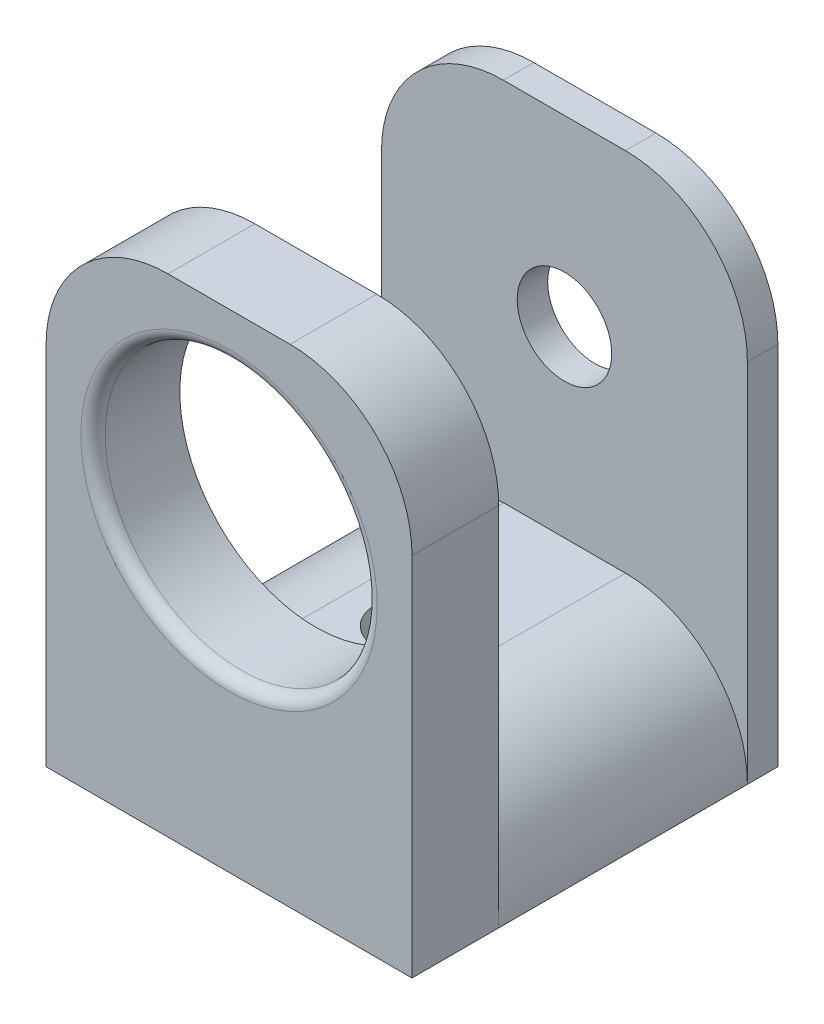
ISO-10303-21;
HEADER;
FILE_DESCRIPTION(('STEP AP214'),'2;1');
FILE_NAME('part.step','',(''),(''),'','','');
FILE_SCHEMA(('AUTOMOTIVE_DESIGN { 1 0 10303 214 1 1 1 1 }'));
ENDSEC;
DATA;
#1=APPLICATION_CONTEXT('core data for automotive mechanical design processes');
#2=APPLICATION_PROTOCOL_DEFINITION('international standard','automotive_design',2000,#1);
#3=PRODUCT_CONTEXT('',#1,'mechanical');
#4=PRODUCT('Part','Part','',(#3));
#5=PRODUCT_RELATED_PRODUCT_CATEGORY('part','',(#4));
#6=PRODUCT_DEFINITION_FORMATION('','',#4);
#7=PRODUCT_DEFINITION_CONTEXT('part definition',#1,'design');
#8=PRODUCT_DEFINITION('design','',#6,#7);
#9=PRODUCT_DEFINITION_SHAPE('','',#8);
#10=(LENGTH_UNIT() NAMED_UNIT(*) SI_UNIT(.MILLI.,.METRE.));
#11=(NAMED_UNIT(*) PLANE_ANGLE_UNIT() SI_UNIT($,.RADIAN.));
#12=(NAMED_UNIT(*) SI_UNIT($,.STERADIAN.) SOLID_ANGLE_UNIT());
#13=UNCERTAINTY_MEASURE_WITH_UNIT(LENGTH_MEASURE(1.E-05),#10,'distance_accuracy_value','');
#14=(GEOMETRIC_REPRESENTATION_CONTEXT(3) GLOBAL_UNCERTAINTY_ASSIGNED_CONTEXT((#13)) GLOBAL_UNIT_ASSIGNED_CONTEXT((#10,
#11,#12)) REPRESENTATION_CONTEXT('',''));
#15=CARTESIAN_POINT('',(0.,0.,0.));
#16=DIRECTION('',(0.,0.,1.));
#17=DIRECTION('',(1.,0.,0.));
#18=AXIS2_PLACEMENT_3D('',#15,#16,#17);
#19=CARTESIAN_POINT('',(-11.8122713901151,10.,-2.11650692687219));
#20=DIRECTION('',(1.,0.,0.));
#21=DIRECTION('',(0.,0.,-1.));
#22=AXIS2_PLACEMENT_3D('',#19,#20,#21);
#23=PLANE('',#22);
#24=DIRECTION('',(0.,-1.,0.));
#25=VECTOR('',#24,1.);
#26=CARTESIAN_POINT('',(-11.8122713901151,10.,-2.11650692687219));
#27=LINE('',#26,#25);
#28=CARTESIAN_POINT('',(-11.8122713901151,30.,-2.11650692687219));
#29=VERTEX_POINT('',#28);
#30=CARTESIAN_POINT('',(-11.8122713901151,0.,-2.11650692687219));
#31=VERTEX_POINT('',#30);
#32=EDGE_CURVE('E178',#29,#31,#27,.T.);
#33=ORIENTED_EDGE('',*,*,#32,.F.);
#34=DIRECTION('',(0.,0.,1.));
#35=VECTOR('',#34,1.);
#36=CARTESIAN_POINT('',(-11.8122713901151,30.,-2.11650692687219));
#37=LINE('',#36,#35);
#38=CARTESIAN_POINT('',(-11.8122713901151,30.,-9.22850692687219));
#39=VERTEX_POINT('',#38);
#40=EDGE_CURVE('E11',#29,#39,#37,.F.);
#41=ORIENTED_EDGE('',*,*,#40,.T.);
#42=DIRECTION('',(0.,-1.,0.));
#43=VECTOR('',#42,1.);
#44=CARTESIAN_POINT('',(-11.8122713901151,40.,-9.22850692687219));
#45=LINE('',#44,#43);
#46=CARTESIAN_POINT('',(-11.8122713901151,0.,-9.22850692687219));
#47=VERTEX_POINT('',#46);
#48=EDGE_CURVE('E223',#39,#47,#45,.T.);
#49=ORIENTED_EDGE('',*,*,#48,.T.);
#50=DIRECTION('',(0.,0.,1.));
#51=VECTOR('',#50,1.);
#52=CARTESIAN_POINT('',(-11.8122713901151,0.,-2.11650692687219));
#53=LINE('',#52,#51);
#54=EDGE_CURVE('E165',#47,#31,#53,.T.);
#55=ORIENTED_EDGE('',*,*,#54,.T.);
#56=EDGE_LOOP('',(#33,#41,#49,#55));
#57=FACE_BOUND('',#56,.T.);
#58=ADVANCED_FACE('F32',(#57),#23,.F.);
#59=CARTESIAN_POINT('',(18.1877286098849,10.,-2.1165069268722));
#60=DIRECTION('',(-1.,0.,0.));
#61=DIRECTION('',(0.,0.,1.));
#62=AXIS2_PLACEMENT_3D('',#59,#60,#61);
#63=PLANE('',#62);
#64=DIRECTION('',(0.,-1.,0.));
#65=VECTOR('',#64,1.);
#66=CARTESIAN_POINT('',(18.1877286098849,40.,-29.6165069268722));
#67=LINE('',#66,#65);
#68=CARTESIAN_POINT('',(18.1877286098849,30.,-29.6165069268722));
#69=VERTEX_POINT('',#68);
#70=CARTESIAN_POINT('',(18.1877286098849,0.,-29.6165069268722));
#71=VERTEX_POINT('',#70);
#72=EDGE_CURVE('E139',#69,#71,#67,.T.);
#73=ORIENTED_EDGE('',*,*,#72,.T.);
#74=DIRECTION('',(0.,0.,-1.));
#75=VECTOR('',#74,1.);
#76=CARTESIAN_POINT('',(18.1877286098849,0.,-2.1165069268722));
#77=LINE('',#76,#75);
#78=CARTESIAN_POINT('',(18.1877286098849,0.,-32.1165069268722));
#79=VERTEX_POINT('',#78);
#80=EDGE_CURVE('E133',#71,#79,#77,.T.);
#81=ORIENTED_EDGE('',*,*,#80,.T.);
#82=DIRECTION('',(0.,-1.,0.));
#83=VECTOR('',#82,1.);
#84=CARTESIAN_POINT('',(18.1877286098849,10.,-32.1165069268722));
#85=LINE('',#84,#83);
#86=CARTESIAN_POINT('',(18.1877286098849,30.,-32.1165069268722));
#87=VERTEX_POINT('',#86);
#88=EDGE_CURVE('E136',#87,#79,#85,.T.);
#89=ORIENTED_EDGE('',*,*,#88,.F.);
#90=DIRECTION('',(0.,0.,-1.));
#91=VECTOR('',#90,1.);
#92=CARTESIAN_POINT('',(18.1877286098849,30.,-29.6165069268722));
#93=LINE('',#92,#91);
#94=EDGE_CURVE('E201',#87,#69,#93,.F.);
#95=ORIENTED_EDGE('',*,*,#94,.T.);
#96=EDGE_LOOP('',(#73,#81,#89,#95));
#97=FACE_BOUND('',#96,.T.);
#98=ADVANCED_FACE('F135',(#97),#63,.F.);
#99=CARTESIAN_POINT('',(0.,10.,0.));
#100=DIRECTION('',(0.,1.,0.));
#101=DIRECTION('',(0.,0.,1.));
#102=AXIS2_PLACEMENT_3D('',#99,#100,#101);
#103=PLANE('',#102);
#104=CARTESIAN_POINT('',(3.18772860988485,10.,-17.1165069268722));
#105=DIRECTION('',(0.,1.,0.));
#106=DIRECTION('',(0.,0.,1.));
#107=AXIS2_PLACEMENT_3D('',#104,#105,#106);
#108=CIRCLE('',#107,3.);
#109=CARTESIAN_POINT('',(3.18772860988485,10.,-14.1165069268722));
#110=VERTEX_POINT('',#109);
#111=EDGE_CURVE('E241',#110,#110,#108,.T.);
#112=ORIENTED_EDGE('',*,*,#111,.F.);
#113=EDGE_LOOP('',(#112));
#114=FACE_BOUND('',#113,.T.);
#115=DIRECTION('',(1.,0.,0.));
#116=VECTOR('',#115,1.);
#117=CARTESIAN_POINT('',(-11.8122713901151,10.,-29.6165069268722));
#118=LINE('',#117,#116);
#119=CARTESIAN_POINT('',(-1.81227139011515,10.,-29.6165069268722));
#120=VERTEX_POINT('',#119);
#121=CARTESIAN_POINT('',(8.18772860988485,10.,-29.6165069268722));
#122=VERTEX_POINT('',#121);
#123=EDGE_CURVE('E211',#120,#122,#118,.T.);
#124=ORIENTED_EDGE('',*,*,#123,.F.);
#125=DIRECTION('',(0.,0.,1.));
#126=VECTOR('',#125,1.);
#127=CARTESIAN_POINT('',(-1.81227139011515,10.,-9.22850692687219));
#128=LINE('',#127,#126);
#129=CARTESIAN_POINT('',(-1.81227139011515,10.,-9.22850692687219));
#130=VERTEX_POINT('',#129);
#131=EDGE_CURVE('E210',#120,#130,#128,.T.);
#132=ORIENTED_EDGE('',*,*,#131,.T.);
#133=DIRECTION('',(-1.,0.,0.));
#134=VECTOR('',#133,1.);
#135=CARTESIAN_POINT('',(-11.8122713901151,10.,-9.22850692687219));
#136=LINE('',#135,#134);
#137=CARTESIAN_POINT('',(8.18772860988485,10.,-9.22850692687219));
#138=VERTEX_POINT('',#137);
#139=EDGE_CURVE('E226',#138,#130,#136,.T.);
#140=ORIENTED_EDGE('',*,*,#139,.F.);
#141=DIRECTION('',(0.,0.,-1.));
#142=VECTOR('',#141,1.);
#143=CARTESIAN_POINT('',(8.18772860988485,10.,-29.6165069268722));
#144=LINE('',#143,#142);
#145=EDGE_CURVE('E203',#138,#122,#144,.T.);
#146=ORIENTED_EDGE('',*,*,#145,.T.);
#147=EDGE_LOOP('',(#124,#132,#140,#146));
#148=FACE_BOUND('',#147,.T.);
#149=ADVANCED_FACE('F247',(#114,#148),#103,.T.);
#150=DIRECTION('',(0.,-1.,0.));
#151=VECTOR('',#150,1.);
#152=CARTESIAN_POINT('',(18.1877286098849,40.,-9.22850692687219));
#153=LINE('',#152,#151);
#154=CARTESIAN_POINT('',(18.1877286098849,30.,-9.22850692687219));
#155=VERTEX_POINT('',#154);
#156=CARTESIAN_POINT('',(18.1877286098849,0.,-9.22850692687219));
#157=VERTEX_POINT('',#156);
#158=EDGE_CURVE('E214',#155,#157,#153,.T.);
#159=ORIENTED_EDGE('',*,*,#158,.F.);
#160=DIRECTION('',(0.,0.,-1.));
#161=VECTOR('',#160,1.);
#162=CARTESIAN_POINT('',(18.1877286098849,30.,-2.1165069268722));
#163=LINE('',#162,#161);
#164=CARTESIAN_POINT('',(18.1877286098849,30.,-2.1165069268722));
#165=VERTEX_POINT('',#164);
#166=EDGE_CURVE('E55',#155,#165,#163,.F.);
#167=ORIENTED_EDGE('',*,*,#166,.T.);
#168=DIRECTION('',(0.,-1.,0.));
#169=VECTOR('',#168,1.);
#170=CARTESIAN_POINT('',(18.1877286098849,10.,-2.1165069268722));
#171=LINE('',#170,#169);
#172=CARTESIAN_POINT('',(18.1877286098849,0.,-2.1165069268722));
#173=VERTEX_POINT('',#172);
#174=EDGE_CURVE('E176',#165,#173,#171,.T.);
#175=ORIENTED_EDGE('',*,*,#174,.T.);
#176=EDGE_CURVE('E148',#173,#157,#77,.T.);
#177=ORIENTED_EDGE('',*,*,#176,.T.);
#178=EDGE_LOOP('',(#159,#167,#175,#177));
#179=FACE_BOUND('',#178,.T.);
#180=ADVANCED_FACE('F250',(#179),#63,.F.);
#181=CARTESIAN_POINT('',(18.1877286098849,10.,-32.1165069268722));
#182=DIRECTION('',(0.,0.,1.));
#183=DIRECTION('',(1.,0.,0.));
#184=AXIS2_PLACEMENT_3D('',#181,#182,#183);
#185=PLANE('',#184);
#186=CARTESIAN_POINT('',(3.18772860988485,25.,-32.1165069268722));
#187=DIRECTION('',(0.,0.,-1.));
#188=DIRECTION('',(-1.,0.,0.));
#189=AXIS2_PLACEMENT_3D('',#186,#187,#188);
#190=CIRCLE('',#189,3.875);
#191=CARTESIAN_POINT('',(-0.687271390115151,25.,-32.1165069268722));
#192=VERTEX_POINT('',#191);
#193=EDGE_CURVE('E238',#192,#192,#190,.T.);
#194=ORIENTED_EDGE('',*,*,#193,.F.);
#195=EDGE_LOOP('',(#194));
#196=FACE_BOUND('',#195,.T.);
#197=DIRECTION('',(0.,-1.,0.));
#198=VECTOR('',#197,1.);
#199=CARTESIAN_POINT('',(-11.8122713901151,10.,-32.1165069268722));
#200=LINE('',#199,#198);
#201=CARTESIAN_POINT('',(-11.8122713901151,30.,-32.1165069268722));
#202=VERTEX_POINT('',#201);
#203=CARTESIAN_POINT('',(-11.8122713901151,0.,-32.1165069268722));
#204=VERTEX_POINT('',#203);
#205=EDGE_CURVE('E158',#202,#204,#200,.T.);
#206=ORIENTED_EDGE('',*,*,#205,.F.);
#207=CARTESIAN_POINT('',(-1.81227139011515,30.,-32.1165069268722));
#208=DIRECTION('',(0.,0.,1.));
#209=DIRECTION('',(1.,0.,0.));
#210=AXIS2_PLACEMENT_3D('',#207,#208,#209);
#211=CIRCLE('',#210,10.);
#212=CARTESIAN_POINT('',(-1.81227139011515,40.,-32.1165069268722));
#213=VERTEX_POINT('',#212);
#214=EDGE_CURVE('E199',#202,#213,#211,.F.);
#215=ORIENTED_EDGE('',*,*,#214,.T.);
#216=DIRECTION('',(-1.,0.,0.));
#217=VECTOR('',#216,1.);
#218=CARTESIAN_POINT('',(-11.8122713901151,40.,-32.1165069268722));
#219=LINE('',#218,#217);
#220=CARTESIAN_POINT('',(8.18772860988485,40.,-32.1165069268722));
#221=VERTEX_POINT('',#220);
#222=EDGE_CURVE('E188',#221,#213,#219,.T.);
#223=ORIENTED_EDGE('',*,*,#222,.F.);
#224=CARTESIAN_POINT('',(8.18772860988485,30.,-32.1165069268722));
#225=DIRECTION('',(0.,0.,1.));
#226=DIRECTION('',(1.,0.,0.));
#227=AXIS2_PLACEMENT_3D('',#224,#225,#226);
#228=CIRCLE('',#227,10.);
#229=EDGE_CURVE('E156',#221,#87,#228,.F.);
#230=ORIENTED_EDGE('',*,*,#229,.T.);
#231=ORIENTED_EDGE('',*,*,#88,.T.);
#232=DIRECTION('',(-1.,0.,0.));
#233=VECTOR('',#232,1.);
#234=CARTESIAN_POINT('',(18.1877286098849,0.,-32.1165069268722));
#235=LINE('',#234,#233);
#236=EDGE_CURVE('E153',#79,#204,#235,.T.);
#237=ORIENTED_EDGE('',*,*,#236,.T.);
#238=EDGE_LOOP('',(#206,#215,#223,#230,#231,#237));
#239=FACE_BOUND('',#238,.T.);
#240=ADVANCED_FACE('F152',(#196,#239),#185,.F.);
#241=CARTESIAN_POINT('',(-11.8122713901151,0.,-29.6165069268722));
#242=VERTEX_POINT('',#241);
#243=EDGE_CURVE('E164',#204,#242,#53,.T.);
#244=ORIENTED_EDGE('',*,*,#243,.T.);
#245=DIRECTION('',(0.,-1.,0.));
#246=VECTOR('',#245,1.);
#247=CARTESIAN_POINT('',(-11.8122713901151,40.,-29.6165069268722));
#248=LINE('',#247,#246);
#249=CARTESIAN_POINT('',(-11.8122713901151,30.,-29.6165069268722));
#250=VERTEX_POINT('',#249);
#251=EDGE_CURVE('E146',#250,#242,#248,.T.);
#252=ORIENTED_EDGE('',*,*,#251,.F.);
#253=DIRECTION('',(0.,0.,1.));
#254=VECTOR('',#253,1.);
#255=CARTESIAN_POINT('',(-11.8122713901151,30.,-32.1165069268722));
#256=LINE('',#255,#254);
#257=EDGE_CURVE('E196',#250,#202,#256,.F.);
#258=ORIENTED_EDGE('',*,*,#257,.T.);
#259=ORIENTED_EDGE('',*,*,#205,.T.);
#260=EDGE_LOOP('',(#244,#252,#258,#259));
#261=FACE_BOUND('',#260,.T.);
#262=ADVANCED_FACE('F341',(#261),#23,.F.);
#263=CARTESIAN_POINT('',(18.1877286098849,10.,-2.1165069268722));
#264=DIRECTION('',(0.,0.,-1.));
#265=DIRECTION('',(-1.,0.,0.));
#266=AXIS2_PLACEMENT_3D('',#263,#264,#265);
#267=PLANE('',#266);
#268=CARTESIAN_POINT('',(3.18772860988485,25.,-2.1165069268722));
#269=DIRECTION('',(0.,0.,-1.));
#270=DIRECTION('',(-1.,0.,0.));
#271=AXIS2_PLACEMENT_3D('',#268,#269,#270);
#272=CIRCLE('',#271,12.1506);
#273=CARTESIAN_POINT('',(-8.96287139011515,25.,-2.1165069268722));
#274=VERTEX_POINT('',#273);
#275=EDGE_CURVE('E313',#274,#274,#272,.T.);
#276=ORIENTED_EDGE('',*,*,#275,.T.);
#277=EDGE_LOOP('',(#276));
#278=FACE_BOUND('',#277,.T.);
#279=ORIENTED_EDGE('',*,*,#174,.F.);
#280=CARTESIAN_POINT('',(8.18772860988485,30.,-2.1165069268722));
#281=DIRECTION('',(0.,0.,-1.));
#282=DIRECTION('',(-1.,0.,0.));
#283=AXIS2_PLACEMENT_3D('',#280,#281,#282);
#284=CIRCLE('',#283,10.);
#285=CARTESIAN_POINT('',(8.18772860988485,40.,-2.11650692687219));
#286=VERTEX_POINT('',#285);
#287=EDGE_CURVE('E40',#165,#286,#284,.F.);
#288=ORIENTED_EDGE('',*,*,#287,.T.);
#289=DIRECTION('',(1.,0.,0.));
#290=VECTOR('',#289,1.);
#291=CARTESIAN_POINT('',(-11.8122713901151,40.,-2.11650692687219));
#292=LINE('',#291,#290);
#293=CARTESIAN_POINT('',(-1.81227139011515,40.,-2.11650692687219));
#294=VERTEX_POINT('',#293);
#295=EDGE_CURVE('E229',#294,#286,#292,.T.);
#296=ORIENTED_EDGE('',*,*,#295,.F.);
#297=CARTESIAN_POINT('',(-1.81227139011515,30.,-2.1165069268722));
#298=DIRECTION('',(0.,0.,-1.));
#299=DIRECTION('',(-1.,0.,0.));
#300=AXIS2_PLACEMENT_3D('',#297,#298,#299);
#301=CIRCLE('',#300,10.);
#302=EDGE_CURVE('E47',#294,#29,#301,.F.);
#303=ORIENTED_EDGE('',*,*,#302,.T.);
#304=ORIENTED_EDGE('',*,*,#32,.T.);
#305=DIRECTION('',(1.,0.,0.));
#306=VECTOR('',#305,1.);
#307=CARTESIAN_POINT('',(18.1877286098849,0.,-2.1165069268722));
#308=LINE('',#307,#306);
#309=EDGE_CURVE('E173',#31,#173,#308,.T.);
#310=ORIENTED_EDGE('',*,*,#309,.T.);
#311=EDGE_LOOP('',(#279,#288,#296,#303,#304,#310));
#312=FACE_BOUND('',#311,.T.);
#313=ADVANCED_FACE('F283',(#278,#312),#267,.F.);
#314=CARTESIAN_POINT('',(0.,0.,0.));
#315=DIRECTION('',(0.,1.,0.));
#316=DIRECTION('',(0.,0.,1.));
#317=AXIS2_PLACEMENT_3D('',#314,#315,#316);
#318=PLANE('',#317);
#319=CARTESIAN_POINT('',(3.18772860988485,0.,-17.1165069268722));
#320=DIRECTION('',(0.,1.,0.));
#321=DIRECTION('',(0.,0.,1.));
#322=AXIS2_PLACEMENT_3D('',#319,#320,#321);
#323=CIRCLE('',#322,4.);
#324=CARTESIAN_POINT('',(3.18772860988485,0.,-13.1165069268722));
#325=VERTEX_POINT('',#324);
#326=EDGE_CURVE('E305',#325,#325,#323,.T.);
#327=ORIENTED_EDGE('',*,*,#326,.T.);
#328=EDGE_LOOP('',(#327));
#329=FACE_BOUND('',#328,.T.);
#330=ORIENTED_EDGE('',*,*,#176,.F.);
#331=ORIENTED_EDGE('',*,*,#309,.F.);
#332=ORIENTED_EDGE('',*,*,#54,.F.);
#333=EDGE_CURVE('E168',#242,#47,#53,.T.);
#334=ORIENTED_EDGE('',*,*,#333,.F.);
#335=ORIENTED_EDGE('',*,*,#243,.F.);
#336=ORIENTED_EDGE('',*,*,#236,.F.);
#337=ORIENTED_EDGE('',*,*,#80,.F.);
#338=EDGE_CURVE('E145',#157,#71,#77,.T.);
#339=ORIENTED_EDGE('',*,*,#338,.F.);
#340=EDGE_LOOP('',(#330,#331,#332,#334,#335,#336,#337,#339));
#341=FACE_BOUND('',#340,.T.);
#342=ADVANCED_FACE('F161',(#329,#341),#318,.F.);
#343=CARTESIAN_POINT('',(-11.8122713901151,40.,-29.6165069268722));
#344=DIRECTION('',(0.,0.,-1.));
#345=DIRECTION('',(-1.,0.,0.));
#346=AXIS2_PLACEMENT_3D('',#343,#344,#345);
#347=PLANE('',#346);
#348=CARTESIAN_POINT('',(3.18772860988485,25.,-29.6165069268722));
#349=DIRECTION('',(0.,0.,-1.));
#350=DIRECTION('',(-1.,0.,0.));
#351=AXIS2_PLACEMENT_3D('',#348,#349,#350);
#352=CIRCLE('',#351,3.875);
#353=CARTESIAN_POINT('',(-0.687271390115151,25.,-29.6165069268722));
#354=VERTEX_POINT('',#353);
#355=EDGE_CURVE('E237',#354,#354,#352,.T.);
#356=ORIENTED_EDGE('',*,*,#355,.T.);
#357=EDGE_LOOP('',(#356));
#358=FACE_BOUND('',#357,.T.);
#359=DIRECTION('',(1.,0.,0.));
#360=VECTOR('',#359,1.);
#361=CARTESIAN_POINT('',(-11.8122713901151,40.,-29.6165069268722));
#362=LINE('',#361,#360);
#363=CARTESIAN_POINT('',(-1.81227139011515,40.,-29.6165069268722));
#364=VERTEX_POINT('',#363);
#365=CARTESIAN_POINT('',(8.18772860988485,40.,-29.6165069268722));
#366=VERTEX_POINT('',#365);
#367=EDGE_CURVE('E213',#364,#366,#362,.T.);
#368=ORIENTED_EDGE('',*,*,#367,.F.);
#369=CARTESIAN_POINT('',(-1.81227139011515,30.,-29.6165069268722));
#370=DIRECTION('',(0.,0.,-1.));
#371=DIRECTION('',(-1.,0.,0.));
#372=AXIS2_PLACEMENT_3D('',#369,#370,#371);
#373=CIRCLE('',#372,10.);
#374=EDGE_CURVE('E194',#364,#250,#373,.F.);
#375=ORIENTED_EDGE('',*,*,#374,.T.);
#376=ORIENTED_EDGE('',*,*,#251,.T.);
#377=CARTESIAN_POINT('',(-1.81227139011515,0.,-29.6165069268722));
#378=DIRECTION('',(0.,0.,-1.));
#379=DIRECTION('',(-1.,0.,0.));
#380=AXIS2_PLACEMENT_3D('',#377,#378,#379);
#381=CIRCLE('',#380,10.);
#382=EDGE_CURVE('E263',#242,#120,#381,.T.);
#383=ORIENTED_EDGE('',*,*,#382,.T.);
#384=ORIENTED_EDGE('',*,*,#123,.T.);
#385=CARTESIAN_POINT('',(8.18772860988485,0.,-29.6165069268722));
#386=DIRECTION('',(0.,0.,-1.));
#387=DIRECTION('',(-1.,0.,0.));
#388=AXIS2_PLACEMENT_3D('',#385,#386,#387);
#389=CIRCLE('',#388,10.);
#390=EDGE_CURVE('E206',#122,#71,#389,.T.);
#391=ORIENTED_EDGE('',*,*,#390,.T.);
#392=ORIENTED_EDGE('',*,*,#72,.F.);
#393=CARTESIAN_POINT('',(8.18772860988485,30.,-29.6165069268722));
#394=DIRECTION('',(0.,0.,-1.));
#395=DIRECTION('',(-1.,0.,0.));
#396=AXIS2_PLACEMENT_3D('',#393,#394,#395);
#397=CIRCLE('',#396,10.);
#398=EDGE_CURVE('E192',#69,#366,#397,.F.);
#399=ORIENTED_EDGE('',*,*,#398,.T.);
#400=EDGE_LOOP('',(#368,#375,#376,#383,#384,#391,#392,#399));
#401=FACE_BOUND('',#400,.T.);
#402=ADVANCED_FACE('F297',(#358,#401),#347,.F.);
#403=CARTESIAN_POINT('',(0.,40.,0.));
#404=DIRECTION('',(0.,1.,0.));
#405=DIRECTION('',(0.,0.,1.));
#406=AXIS2_PLACEMENT_3D('',#403,#404,#405);
#407=PLANE('',#406);
#408=ORIENTED_EDGE('',*,*,#222,.T.);
#409=DIRECTION('',(0.,0.,1.));
#410=VECTOR('',#409,1.);
#411=CARTESIAN_POINT('',(-1.81227139011515,40.,-29.6165069268722));
#412=LINE('',#411,#410);
#413=EDGE_CURVE('E189',#213,#364,#412,.T.);
#414=ORIENTED_EDGE('',*,*,#413,.T.);
#415=ORIENTED_EDGE('',*,*,#367,.T.);
#416=DIRECTION('',(0.,0.,-1.));
#417=VECTOR('',#416,1.);
#418=CARTESIAN_POINT('',(8.18772860988485,40.,-32.1165069268722));
#419=LINE('',#418,#417);
#420=EDGE_CURVE('E303',#366,#221,#419,.T.);
#421=ORIENTED_EDGE('',*,*,#420,.T.);
#422=EDGE_LOOP('',(#408,#414,#415,#421));
#423=FACE_BOUND('',#422,.T.);
#424=ADVANCED_FACE('F361',(#423),#407,.T.);
#425=CARTESIAN_POINT('',(-11.8122713901151,40.,-9.22850692687219));
#426=DIRECTION('',(0.,0.,1.));
#427=DIRECTION('',(1.,0.,0.));
#428=AXIS2_PLACEMENT_3D('',#425,#426,#427);
#429=PLANE('',#428);
#430=CARTESIAN_POINT('',(3.18772860988485,25.,-9.22850692687219));
#431=DIRECTION('',(0.,0.,1.));
#432=DIRECTION('',(1.,0.,0.));
#433=AXIS2_PLACEMENT_3D('',#430,#431,#432);
#434=CIRCLE('',#433,11.1506);
#435=CARTESIAN_POINT('',(14.3383286098849,25.,-9.2285069268722));
#436=VERTEX_POINT('',#435);
#437=EDGE_CURVE('E230',#436,#436,#434,.F.);
#438=ORIENTED_EDGE('',*,*,#437,.F.);
#439=EDGE_LOOP('',(#438));
#440=FACE_BOUND('',#439,.T.);
#441=DIRECTION('',(-1.,0.,0.));
#442=VECTOR('',#441,1.);
#443=CARTESIAN_POINT('',(-11.8122713901151,40.,-9.22850692687219));
#444=LINE('',#443,#442);
#445=CARTESIAN_POINT('',(8.18772860988485,40.,-9.22850692687219));
#446=VERTEX_POINT('',#445);
#447=CARTESIAN_POINT('',(-1.81227139011515,40.,-9.22850692687219));
#448=VERTEX_POINT('',#447);
#449=EDGE_CURVE('E225',#446,#448,#444,.T.);
#450=ORIENTED_EDGE('',*,*,#449,.F.);
#451=CARTESIAN_POINT('',(8.18772860988485,30.,-9.22850692687219));
#452=DIRECTION('',(0.,0.,1.));
#453=DIRECTION('',(1.,0.,0.));
#454=AXIS2_PLACEMENT_3D('',#451,#452,#453);
#455=CIRCLE('',#454,10.);
#456=EDGE_CURVE('E279',#446,#155,#455,.F.);
#457=ORIENTED_EDGE('',*,*,#456,.T.);
#458=ORIENTED_EDGE('',*,*,#158,.T.);
#459=CARTESIAN_POINT('',(8.18772860988485,0.,-9.22850692687219));
#460=DIRECTION('',(0.,0.,1.));
#461=DIRECTION('',(1.,0.,0.));
#462=AXIS2_PLACEMENT_3D('',#459,#460,#461);
#463=CIRCLE('',#462,10.);
#464=EDGE_CURVE('E208',#157,#138,#463,.T.);
#465=ORIENTED_EDGE('',*,*,#464,.T.);
#466=ORIENTED_EDGE('',*,*,#139,.T.);
#467=CARTESIAN_POINT('',(-1.81227139011515,0.,-9.22850692687219));
#468=DIRECTION('',(0.,0.,1.));
#469=DIRECTION('',(1.,0.,0.));
#470=AXIS2_PLACEMENT_3D('',#467,#468,#469);
#471=CIRCLE('',#470,10.);
#472=EDGE_CURVE('E265',#130,#47,#471,.T.);
#473=ORIENTED_EDGE('',*,*,#472,.T.);
#474=ORIENTED_EDGE('',*,*,#48,.F.);
#475=CARTESIAN_POINT('',(-1.81227139011515,30.,-9.22850692687219));
#476=DIRECTION('',(0.,0.,1.));
#477=DIRECTION('',(1.,0.,0.));
#478=AXIS2_PLACEMENT_3D('',#475,#476,#477);
#479=CIRCLE('',#478,10.);
#480=EDGE_CURVE('E277',#39,#448,#479,.F.);
#481=ORIENTED_EDGE('',*,*,#480,.T.);
#482=EDGE_LOOP('',(#450,#457,#458,#465,#466,#473,#474,#481));
#483=FACE_BOUND('',#482,.T.);
#484=ADVANCED_FACE('F291',(#440,#483),#429,.F.);
#485=CARTESIAN_POINT('',(0.,40.,0.));
#486=DIRECTION('',(0.,-1.,0.));
#487=DIRECTION('',(0.,0.,-1.));
#488=AXIS2_PLACEMENT_3D('',#485,#486,#487);
#489=PLANE('',#488);
#490=ORIENTED_EDGE('',*,*,#295,.T.);
#491=DIRECTION('',(0.,0.,-1.));
#492=VECTOR('',#491,1.);
#493=CARTESIAN_POINT('',(8.18772860988485,40.,0.));
#494=LINE('',#493,#492);
#495=EDGE_CURVE('E274',#286,#446,#494,.T.);
#496=ORIENTED_EDGE('',*,*,#495,.T.);
#497=ORIENTED_EDGE('',*,*,#449,.T.);
#498=DIRECTION('',(0.,0.,1.));
#499=VECTOR('',#498,1.);
#500=CARTESIAN_POINT('',(-1.81227139011515,40.,0.));
#501=LINE('',#500,#499);
#502=EDGE_CURVE('E269',#448,#294,#501,.T.);
#503=ORIENTED_EDGE('',*,*,#502,.T.);
#504=EDGE_LOOP('',(#490,#496,#497,#503));
#505=FACE_BOUND('',#504,.T.);
#506=ADVANCED_FACE('F287',(#505),#489,.F.);
#507=CARTESIAN_POINT('',(3.18772860988485,25.,-32.1175069268722));
#508=DIRECTION('',(0.,0.,1.));
#509=DIRECTION('',(1.,0.,0.));
#510=AXIS2_PLACEMENT_3D('',#507,#508,#509);
#511=CYLINDRICAL_SURFACE('',#510,11.1506);
#512=CARTESIAN_POINT('',(3.18772860988485,25.,-3.1165069268722));
#513=DIRECTION('',(0.,0.,-1.));
#514=DIRECTION('',(-1.,0.,0.));
#515=AXIS2_PLACEMENT_3D('',#512,#513,#514);
#516=CIRCLE('',#515,11.1506);
#517=CARTESIAN_POINT('',(14.3383286098849,25.,-3.1165069268722));
#518=VERTEX_POINT('',#517);
#519=EDGE_CURVE('E157',#518,#518,#516,.F.);
#520=CARTESIAN_POINT('',(14.3383286098849,25.,-3.1165069268722));
#521=CARTESIAN_POINT('',(14.3383286098849,25.,-3.18017359353887));
#522=CARTESIAN_POINT('',(14.3383286098849,25.,-3.24384026020553));
#523=CARTESIAN_POINT('',(14.3383286098849,25.,-3.37117359353887));
#524=CARTESIAN_POINT('',(14.3383286098849,25.,-3.43484026020553));
#525=CARTESIAN_POINT('',(14.3383286098849,25.,-3.56217359353887));
#526=CARTESIAN_POINT('',(14.3383286098849,25.,-3.62584026020553));
#527=CARTESIAN_POINT('',(14.3383286098849,25.,-3.75317359353887));
#528=CARTESIAN_POINT('',(14.3383286098849,25.,-3.81684026020553));
#529=CARTESIAN_POINT('',(14.3383286098849,25.,-3.94417359353887));
#530=CARTESIAN_POINT('',(14.3383286098849,25.,-4.00784026020553));
#531=CARTESIAN_POINT('',(14.3383286098849,25.,-4.13517359353887));
#532=CARTESIAN_POINT('',(14.3383286098849,25.,-4.19884026020553));
#533=CARTESIAN_POINT('',(14.3383286098849,25.,-4.32617359353887));
#534=CARTESIAN_POINT('',(14.3383286098849,25.,-4.38984026020553));
#535=CARTESIAN_POINT('',(14.3383286098849,25.,-4.51717359353887));
#536=CARTESIAN_POINT('',(14.3383286098849,25.,-4.58084026020553));
#537=CARTESIAN_POINT('',(14.3383286098849,25.,-4.70817359353887));
#538=CARTESIAN_POINT('',(14.3383286098849,25.,-4.77184026020553));
#539=CARTESIAN_POINT('',(14.3383286098849,25.,-4.89917359353886));
#540=CARTESIAN_POINT('',(14.3383286098849,25.,-4.96284026020553));
#541=CARTESIAN_POINT('',(14.3383286098849,25.,-5.09017359353886));
#542=CARTESIAN_POINT('',(14.3383286098849,25.,-5.15384026020553));
#543=CARTESIAN_POINT('',(14.3383286098849,25.,-5.28117359353886));
#544=CARTESIAN_POINT('',(14.3383286098849,25.,-5.34484026020553));
#545=CARTESIAN_POINT('',(14.3383286098849,25.,-5.47217359353886));
#546=CARTESIAN_POINT('',(14.3383286098849,25.,-5.53584026020553));
#547=CARTESIAN_POINT('',(14.3383286098849,25.,-5.66317359353886));
#548=CARTESIAN_POINT('',(14.3383286098849,25.,-5.72684026020553));
#549=CARTESIAN_POINT('',(14.3383286098849,25.,-5.85417359353886));
#550=CARTESIAN_POINT('',(14.3383286098849,25.,-5.91784026020553));
#551=CARTESIAN_POINT('',(14.3383286098849,25.,-6.04517359353886));
#552=CARTESIAN_POINT('',(14.3383286098849,25.,-6.10884026020553));
#553=CARTESIAN_POINT('',(14.3383286098849,25.,-6.23617359353887));
#554=CARTESIAN_POINT('',(14.3383286098849,25.,-6.29984026020553));
#555=CARTESIAN_POINT('',(14.3383286098849,25.,-6.42717359353886));
#556=CARTESIAN_POINT('',(14.3383286098849,25.,-6.49084026020553));
#557=CARTESIAN_POINT('',(14.3383286098849,25.,-6.61817359353887));
#558=CARTESIAN_POINT('',(14.3383286098849,25.,-6.68184026020553));
#559=CARTESIAN_POINT('',(14.3383286098849,25.,-6.80917359353887));
#560=CARTESIAN_POINT('',(14.3383286098849,25.,-6.87284026020553));
#561=CARTESIAN_POINT('',(14.3383286098849,25.,-7.00017359353887));
#562=CARTESIAN_POINT('',(14.3383286098849,25.,-7.06384026020553));
#563=CARTESIAN_POINT('',(14.3383286098849,25.,-7.19117359353887));
#564=CARTESIAN_POINT('',(14.3383286098849,25.,-7.25484026020553));
#565=CARTESIAN_POINT('',(14.3383286098849,25.,-7.38217359353886));
#566=CARTESIAN_POINT('',(14.3383286098849,25.,-7.44584026020553));
#567=CARTESIAN_POINT('',(14.3383286098849,25.,-7.57317359353887));
#568=CARTESIAN_POINT('',(14.3383286098849,25.,-7.63684026020553));
#569=CARTESIAN_POINT('',(14.3383286098849,25.,-7.76417359353886));
#570=CARTESIAN_POINT('',(14.3383286098849,25.,-7.82784026020553));
#571=CARTESIAN_POINT('',(14.3383286098849,25.,-7.95517359353887));
#572=CARTESIAN_POINT('',(14.3383286098849,25.,-8.01884026020553));
#573=CARTESIAN_POINT('',(14.3383286098849,25.,-8.14617359353886));
#574=CARTESIAN_POINT('',(14.3383286098849,25.,-8.20984026020553));
#575=CARTESIAN_POINT('',(14.3383286098849,25.,-8.33717359353886));
#576=CARTESIAN_POINT('',(14.3383286098849,25.,-8.40084026020553));
#577=CARTESIAN_POINT('',(14.3383286098849,25.,-8.52817359353886));
#578=CARTESIAN_POINT('',(14.3383286098849,25.,-8.59184026020553));
#579=CARTESIAN_POINT('',(14.3383286098849,25.,-8.71917359353886));
#580=CARTESIAN_POINT('',(14.3383286098849,25.,-8.78284026020553));
#581=CARTESIAN_POINT('',(14.3383286098849,25.,-8.91017359353886));
#582=CARTESIAN_POINT('',(14.3383286098849,25.,-8.97384026020553));
#583=CARTESIAN_POINT('',(14.3383286098849,25.,-9.10117359353887));
#584=CARTESIAN_POINT('',(14.3383286098849,25.,-9.16484026020553));
#585=CARTESIAN_POINT('',(14.3383286098849,25.,-9.2285069268722));
#586=B_SPLINE_CURVE_WITH_KNOTS('',3,(#520,#521,#522,#523,#524,#525,#526,#527,#528,#529,#530,
#531,#532,#533,#534,#535,#536,#537,#538,#539,#540,#541,#542,#543,#544,#545,#546,#547,#548,#549,
#550,#551,#552,#553,#554,#555,#556,#557,#558,#559,#560,#561,#562,#563,#564,#565,#566,#567,#568,
#569,#570,#571,#572,#573,#574,#575,#576,#577,#578,#579,#580,#581,#582,#583,#584,#585),
.UNSPECIFIED.,.F.,.F.,(4,2,2,2,2,2,2,2,2,2,2,2,2,2,2,2,2,2,2,2,2,2,2,2,2,2,2,2,2,2,2,2,4),(0.,
0.191,0.382,0.573000000000001,0.764000000000001,0.955000000000001,1.146,1.337,1.528,1.719,1.91,
2.101,2.292,2.483,2.674,2.865,3.056,3.247,3.438,3.629,3.82,4.011,4.202,4.393,4.584,4.775,4.966,
5.157,5.348,5.539,5.73,5.921,6.112),.UNSPECIFIED.);
#587=EDGE_CURVE('BSEAM320',#518,#436,#586,.T.);
#588=ORIENTED_EDGE('',*,*,#519,.T.);
#589=ORIENTED_EDGE('',*,*,#437,.T.);
#590=ORIENTED_EDGE('',*,*,#587,.T.);
#591=ORIENTED_EDGE('',*,*,#587,.F.);
#592=EDGE_LOOP('',(#588,#590,#589,#591));
#593=FACE_BOUND('',#592,.T.);
#594=ADVANCED_FACE('F320',(#593),#511,.F.);
#595=CARTESIAN_POINT('',(3.18772860988485,25.,-3.1165069268722));
#596=DIRECTION('',(0.,0.,-1.));
#597=DIRECTION('',(-1.,0.,0.));
#598=AXIS2_PLACEMENT_3D('',#595,#596,#597);
#599=TOROIDAL_SURFACE('',#598,12.1506,1.);
#600=ORIENTED_EDGE('',*,*,#275,.F.);
#601=EDGE_LOOP('',(#600));
#602=FACE_BOUND('',#601,.T.);
#603=ORIENTED_EDGE('',*,*,#519,.F.);
#604=EDGE_LOOP('',(#603));
#605=FACE_BOUND('',#604,.T.);
#606=ADVANCED_FACE('F323',(#602,#605),#599,.T.);
#607=CARTESIAN_POINT('',(3.18772860988486,25.,-2.11650692687219));
#608=DIRECTION('',(0.,0.,-1.));
#609=DIRECTION('',(-1.,0.,0.));
#610=AXIS2_PLACEMENT_3D('',#607,#608,#609);
#611=CYLINDRICAL_SURFACE('',#610,3.875);
#612=ORIENTED_EDGE('',*,*,#193,.T.);
#613=EDGE_LOOP('',(#612));
#614=FACE_BOUND('',#613,.T.);
#615=ORIENTED_EDGE('',*,*,#355,.F.);
#616=EDGE_LOOP('',(#615));
#617=FACE_BOUND('',#616,.T.);
#618=ADVANCED_FACE('F325',(#614,#617),#611,.F.);
#619=CARTESIAN_POINT('',(3.18772860988485,30.,-17.1165069268722));
#620=DIRECTION('',(0.,-1.,0.));
#621=DIRECTION('',(0.,0.,-1.));
#622=AXIS2_PLACEMENT_3D('',#619,#620,#621);
#623=CYLINDRICAL_SURFACE('',#622,3.);
#624=CARTESIAN_POINT('',(3.18772860988485,1.,-17.1165069268722));
#625=DIRECTION('',(0.,1.,0.));
#626=DIRECTION('',(0.,0.,1.));
#627=AXIS2_PLACEMENT_3D('',#624,#625,#626);
#628=CIRCLE('',#627,3.);
#629=CARTESIAN_POINT('',(3.18772860988485,1.,-14.1165069268722));
#630=VERTEX_POINT('',#629);
#631=EDGE_CURVE('E308',#630,#630,#628,.F.);
#632=ORIENTED_EDGE('',*,*,#631,.T.);
#633=EDGE_LOOP('',(#632));
#634=FACE_BOUND('',#633,.T.);
#635=ORIENTED_EDGE('',*,*,#111,.T.);
#636=EDGE_LOOP('',(#635));
#637=FACE_BOUND('',#636,.T.);
#638=ADVANCED_FACE('F245',(#634,#637),#623,.F.);
#639=CARTESIAN_POINT('',(3.18772860988485,1.,-17.1165069268722));
#640=DIRECTION('',(0.,1.,0.));
#641=DIRECTION('',(0.,0.,1.));
#642=AXIS2_PLACEMENT_3D('',#639,#640,#641);
#643=TOROIDAL_SURFACE('',#642,4.,1.);
#644=ORIENTED_EDGE('',*,*,#326,.F.);
#645=EDGE_LOOP('',(#644));
#646=FACE_BOUND('',#645,.T.);
#647=ORIENTED_EDGE('',*,*,#631,.F.);
#648=EDGE_LOOP('',(#647));
#649=FACE_BOUND('',#648,.T.);
#650=ADVANCED_FACE('F379',(#646,#649),#643,.T.);
#651=CARTESIAN_POINT('',(-1.81227139011515,30.,0.));
#652=DIRECTION('',(0.,0.,-1.));
#653=DIRECTION('',(-1.,0.,0.));
#654=AXIS2_PLACEMENT_3D('',#651,#652,#653);
#655=CYLINDRICAL_SURFACE('',#654,10.);
#656=ORIENTED_EDGE('',*,*,#214,.F.);
#657=ORIENTED_EDGE('',*,*,#257,.F.);
#658=ORIENTED_EDGE('',*,*,#374,.F.);
#659=ORIENTED_EDGE('',*,*,#413,.F.);
#660=EDGE_LOOP('',(#656,#657,#658,#659));
#661=FACE_BOUND('',#660,.T.);
#662=ADVANCED_FACE('F360',(#661),#655,.T.);
#663=CARTESIAN_POINT('',(8.18772860988485,30.,0.));
#664=DIRECTION('',(0.,0.,1.));
#665=DIRECTION('',(1.,0.,0.));
#666=AXIS2_PLACEMENT_3D('',#663,#664,#665);
#667=CYLINDRICAL_SURFACE('',#666,10.);
#668=ORIENTED_EDGE('',*,*,#398,.F.);
#669=ORIENTED_EDGE('',*,*,#94,.F.);
#670=ORIENTED_EDGE('',*,*,#229,.F.);
#671=ORIENTED_EDGE('',*,*,#420,.F.);
#672=EDGE_LOOP('',(#668,#669,#670,#671));
#673=FACE_BOUND('',#672,.T.);
#674=ADVANCED_FACE('F301',(#673),#667,.T.);
#675=CARTESIAN_POINT('',(8.18772860988485,0.,0.));
#676=DIRECTION('',(0.,0.,1.));
#677=DIRECTION('',(1.,0.,0.));
#678=AXIS2_PLACEMENT_3D('',#675,#676,#677);
#679=CYLINDRICAL_SURFACE('',#678,10.);
#680=ORIENTED_EDGE('',*,*,#464,.F.);
#681=ORIENTED_EDGE('',*,*,#338,.T.);
#682=ORIENTED_EDGE('',*,*,#390,.F.);
#683=ORIENTED_EDGE('',*,*,#145,.F.);
#684=EDGE_LOOP('',(#680,#681,#682,#683));
#685=FACE_BOUND('',#684,.T.);
#686=ADVANCED_FACE('F295',(#685),#679,.T.);
#687=CARTESIAN_POINT('',(-1.81227139011515,0.,0.));
#688=DIRECTION('',(0.,0.,-1.));
#689=DIRECTION('',(-1.,0.,0.));
#690=AXIS2_PLACEMENT_3D('',#687,#688,#689);
#691=CYLINDRICAL_SURFACE('',#690,10.);
#692=ORIENTED_EDGE('',*,*,#382,.F.);
#693=ORIENTED_EDGE('',*,*,#333,.T.);
#694=ORIENTED_EDGE('',*,*,#472,.F.);
#695=ORIENTED_EDGE('',*,*,#131,.F.);
#696=EDGE_LOOP('',(#692,#693,#694,#695));
#697=FACE_BOUND('',#696,.T.);
#698=ADVANCED_FACE('F261',(#697),#691,.T.);
#699=CARTESIAN_POINT('',(8.18772860988485,30.,0.));
#700=DIRECTION('',(0.,0.,-1.));
#701=DIRECTION('',(-1.,0.,0.));
#702=AXIS2_PLACEMENT_3D('',#699,#700,#701);
#703=CYLINDRICAL_SURFACE('',#702,10.);
#704=ORIENTED_EDGE('',*,*,#287,.F.);
#705=ORIENTED_EDGE('',*,*,#166,.F.);
#706=ORIENTED_EDGE('',*,*,#456,.F.);
#707=ORIENTED_EDGE('',*,*,#495,.F.);
#708=EDGE_LOOP('',(#704,#705,#706,#707));
#709=FACE_BOUND('',#708,.T.);
#710=ADVANCED_FACE('F290',(#709),#703,.T.);
#711=CARTESIAN_POINT('',(-1.81227139011515,30.,0.));
#712=DIRECTION('',(0.,0.,1.));
#713=DIRECTION('',(1.,0.,0.));
#714=AXIS2_PLACEMENT_3D('',#711,#712,#713);
#715=CYLINDRICAL_SURFACE('',#714,10.);
#716=ORIENTED_EDGE('',*,*,#480,.F.);
#717=ORIENTED_EDGE('',*,*,#40,.F.);
#718=ORIENTED_EDGE('',*,*,#302,.F.);
#719=ORIENTED_EDGE('',*,*,#502,.F.);
#720=EDGE_LOOP('',(#716,#717,#718,#719));
#721=FACE_BOUND('',#720,.T.);
#722=ADVANCED_FACE('F34',(#721),#715,.T.);
#723=CLOSED_SHELL('',(#58,#98,#149,#180,#240,#262,#313,#342,#402,#424,#484,#506,#594,#606,#618,
#638,#650,#662,#674,#686,#698,#710,#722));
#724=MANIFOLD_SOLID_BREP('B2',#723);
#725=ADVANCED_BREP_SHAPE_REPRESENTATION('',(#18,#724),#14);
#726=SHAPE_DEFINITION_REPRESENTATION(#9,#725);
ENDSEC;
END-ISO-10303-21;
